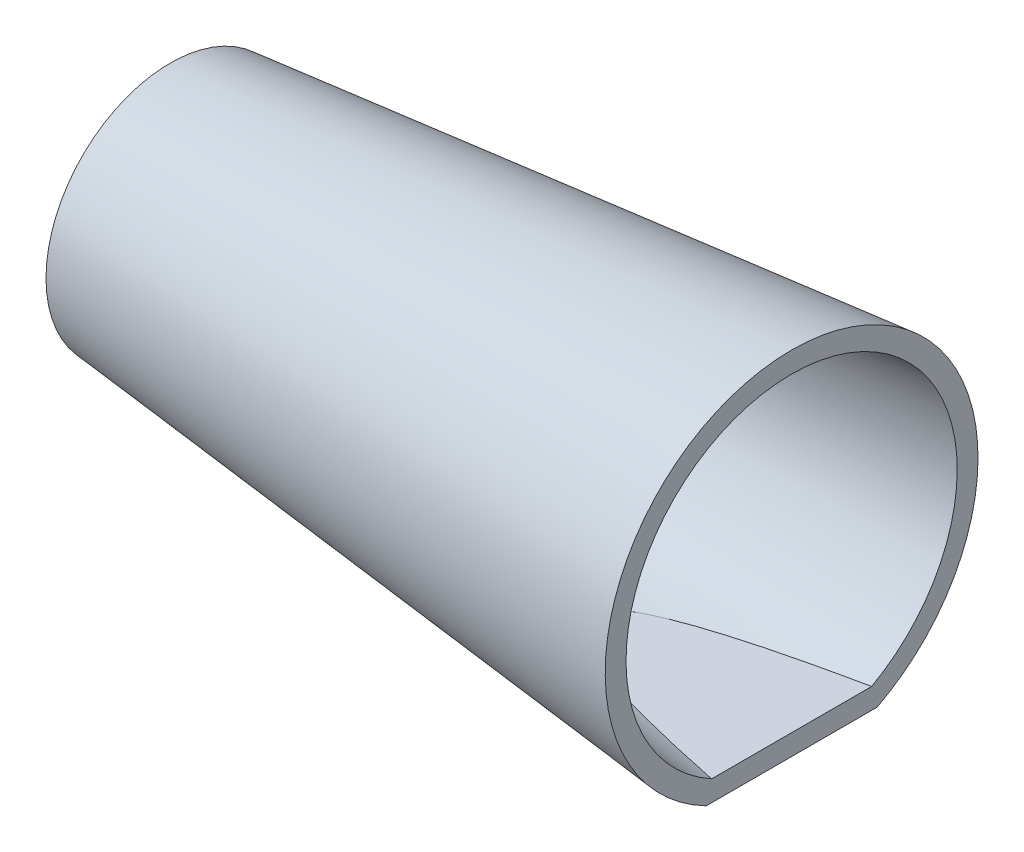
ISO-10303-21;
HEADER;
FILE_DESCRIPTION(('STEP AP214'),'2;1');
FILE_NAME('part.step','',(''),(''),'','','');
FILE_SCHEMA(('AUTOMOTIVE_DESIGN { 1 0 10303 214 1 1 1 1 }'));
ENDSEC;
DATA;
#1=APPLICATION_CONTEXT('core data for automotive mechanical design processes');
#2=APPLICATION_PROTOCOL_DEFINITION('international standard','automotive_design',2000,#1);
#3=PRODUCT_CONTEXT('',#1,'mechanical');
#4=PRODUCT('Part','Part','',(#3));
#5=PRODUCT_RELATED_PRODUCT_CATEGORY('part','',(#4));
#6=PRODUCT_DEFINITION_FORMATION('','',#4);
#7=PRODUCT_DEFINITION_CONTEXT('part definition',#1,'design');
#8=PRODUCT_DEFINITION('design','',#6,#7);
#9=PRODUCT_DEFINITION_SHAPE('','',#8);
#10=(LENGTH_UNIT() NAMED_UNIT(*) SI_UNIT(.MILLI.,.METRE.));
#11=(NAMED_UNIT(*) PLANE_ANGLE_UNIT() SI_UNIT($,.RADIAN.));
#12=(NAMED_UNIT(*) SI_UNIT($,.STERADIAN.) SOLID_ANGLE_UNIT());
#13=UNCERTAINTY_MEASURE_WITH_UNIT(LENGTH_MEASURE(1.E-05),#10,'distance_accuracy_value','');
#14=(GEOMETRIC_REPRESENTATION_CONTEXT(3) GLOBAL_UNCERTAINTY_ASSIGNED_CONTEXT((#13)) GLOBAL_UNIT_ASSIGNED_CONTEXT((#10,
#11,#12)) REPRESENTATION_CONTEXT('',''));
#15=CARTESIAN_POINT('',(0.,0.,0.));
#16=DIRECTION('',(0.,0.,1.));
#17=DIRECTION('',(1.,0.,0.));
#18=AXIS2_PLACEMENT_3D('',#15,#16,#17);
#19=CARTESIAN_POINT('',(71.458830615717,45.,0.));
#20=DIRECTION('',(-1.,0.,0.));
#21=DIRECTION('',(0.,0.,1.));
#22=AXIS2_PLACEMENT_3D('',#19,#20,#21);
#23=PLANE('',#22);
#24=CARTESIAN_POINT('',(71.458830615717,0.,0.));
#25=DIRECTION('',(-1.,0.,0.));
#26=DIRECTION('',(0.,0.,1.));
#27=AXIS2_PLACEMENT_3D('',#24,#25,#26);
#28=CIRCLE('',#27,39.9750621894396);
#29=CARTESIAN_POINT('',(71.458830615717,-35.,19.3133528174049));
#30=VERTEX_POINT('',#29);
#31=CARTESIAN_POINT('',(71.458830615717,-35.,-19.3133528174049));
#32=VERTEX_POINT('',#31);
#33=EDGE_CURVE('E78',#30,#32,#28,.T.);
#34=ORIENTED_EDGE('',*,*,#33,.T.);
#35=DIRECTION('',(0.,0.,1.));
#36=VECTOR('',#35,1.);
#37=CARTESIAN_POINT('',(71.458830615717,-35.,28.2842712474619));
#38=LINE('',#37,#36);
#39=EDGE_CURVE('E62',#32,#30,#38,.T.);
#40=ORIENTED_EDGE('',*,*,#39,.T.);
#41=EDGE_LOOP('',(#34,#40));
#42=FACE_BOUND('',#41,.T.);
#43=DIRECTION('',(0.,0.,1.));
#44=VECTOR('',#43,1.);
#45=CARTESIAN_POINT('',(71.458830615717,-40.,20.6155281280883));
#46=LINE('',#45,#44);
#47=CARTESIAN_POINT('',(71.458830615717,-40.,-20.6155281280883));
#48=VERTEX_POINT('',#47);
#49=CARTESIAN_POINT('',(71.458830615717,-40.,20.6155281280883));
#50=VERTEX_POINT('',#49);
#51=EDGE_CURVE('E56',#48,#50,#46,.T.);
#52=ORIENTED_EDGE('',*,*,#51,.F.);
#53=CARTESIAN_POINT('',(71.458830615717,0.,0.));
#54=DIRECTION('',(-1.,0.,0.));
#55=DIRECTION('',(0.,0.,1.));
#56=AXIS2_PLACEMENT_3D('',#53,#54,#55);
#57=CIRCLE('',#56,45.);
#58=EDGE_CURVE('E73',#50,#48,#57,.T.);
#59=ORIENTED_EDGE('',*,*,#58,.F.);
#60=EDGE_LOOP('',(#52,#59));
#61=FACE_BOUND('',#60,.T.);
#62=ADVANCED_FACE('F39',(#42,#61),#23,.F.);
#63=CARTESIAN_POINT('',(-78.541169384283,30.,0.));
#64=DIRECTION('',(1.,0.,0.));
#65=DIRECTION('',(0.,0.,-1.));
#66=AXIS2_PLACEMENT_3D('',#63,#64,#65);
#67=PLANE('',#66);
#68=CARTESIAN_POINT('',(-78.541169384283,0.,0.));
#69=DIRECTION('',(-1.,0.,0.));
#70=DIRECTION('',(0.,0.,1.));
#71=AXIS2_PLACEMENT_3D('',#68,#69,#70);
#72=CIRCLE('',#71,24.9750621894396);
#73=CARTESIAN_POINT('',(-78.541169384283,0.,24.9750621894396));
#74=VERTEX_POINT('',#73);
#75=EDGE_CURVE('E52',#74,#74,#72,.T.);
#76=ORIENTED_EDGE('',*,*,#75,.F.);
#77=EDGE_LOOP('',(#76));
#78=FACE_BOUND('',#77,.T.);
#79=CARTESIAN_POINT('',(-78.541169384283,0.,0.));
#80=DIRECTION('',(-1.,0.,0.));
#81=DIRECTION('',(0.,0.,1.));
#82=AXIS2_PLACEMENT_3D('',#79,#80,#81);
#83=CIRCLE('',#82,30.);
#84=CARTESIAN_POINT('',(-78.541169384283,0.,30.));
#85=VERTEX_POINT('',#84);
#86=EDGE_CURVE('E77',#85,#85,#83,.T.);
#87=ORIENTED_EDGE('',*,*,#86,.T.);
#88=EDGE_LOOP('',(#87));
#89=FACE_BOUND('',#88,.T.);
#90=ADVANCED_FACE('F41',(#78,#89),#67,.F.);
#91=CARTESIAN_POINT('',(-78.541169384283,0.,0.));
#92=DIRECTION('',(1.,0.,0.));
#93=DIRECTION('',(0.,0.,-1.));
#94=AXIS2_PLACEMENT_3D('',#91,#92,#93);
#95=CONICAL_SURFACE('',#94,24.9750621894396,0.0996686524911621);
#96=ORIENTED_EDGE('',*,*,#33,.F.);
#97=CARTESIAN_POINT('',(186.350283546478,-35.,37.7301557352129));
#98=CARTESIAN_POINT('',(182.454279049554,-35.,37.1986815468563));
#99=CARTESIAN_POINT('',(178.558950301767,-35.,36.6622149826518));
#100=CARTESIAN_POINT('',(170.769889321249,-35.,35.5776494343136));
#101=CARTESIAN_POINT('',(166.876157098331,-35.,35.0295503797463));
#102=CARTESIAN_POINT('',(159.089317005494,-35.,33.9198984021093));
#103=CARTESIAN_POINT('',(155.196209749136,-35.,33.3583411670407));
#104=CARTESIAN_POINT('',(147.412255762658,-35.,32.219809545767));
#105=CARTESIAN_POINT('',(143.521409027725,-35.,31.6428351925238));
#106=CARTESIAN_POINT('',(135.804779735487,-35.,30.4801963457749));
#107=CARTESIAN_POINT('',(131.978953936021,-35.,29.8948193882431));
#108=CARTESIAN_POINT('',(124.330543258662,-35.,28.703284255988));
#109=CARTESIAN_POINT('',(120.507958373713,-35.,28.0971261266366));
#110=CARTESIAN_POINT('',(112.867658375,-35.,26.85989129704));
#111=CARTESIAN_POINT('',(109.049942383243,-35.,26.2288200425046));
#112=CARTESIAN_POINT('',(103.327313455732,-35.,25.2590244248274));
#113=CARTESIAN_POINT('',(101.420433388773,-35.,24.9318953896265));
#114=CARTESIAN_POINT('',(97.6081866569257,-35.,24.2689421279981));
#115=CARTESIAN_POINT('',(95.7028199892517,-35.,23.9331179176187));
#116=CARTESIAN_POINT('',(91.8876891066364,-35.,23.2505547987246));
#117=CARTESIAN_POINT('',(89.9779305654848,-35.,22.9037841400547));
#118=CARTESIAN_POINT('',(86.1604945830343,-35.,22.198980976793));
#119=CARTESIAN_POINT('',(84.2528171364774,-35.,21.8409485007231));
#120=CARTESIAN_POINT('',(80.4391431665994,-35.,21.1117600640936));
#121=CARTESIAN_POINT('',(78.5331476753735,-35.,20.7405986955487));
#122=CARTESIAN_POINT('',(74.7241710566174,-35.,19.9831395175992));
#123=CARTESIAN_POINT('',(72.8211899130663,-35.,19.5968417889252));
#124=CARTESIAN_POINT('',(68.9975239063445,-35.,18.8018858782899));
#125=CARTESIAN_POINT('',(67.0768810803262,-35.,18.3930248374993));
#126=CARTESIAN_POINT('',(63.2404480185547,-35.,17.5531912073763));
#127=CARTESIAN_POINT('',(61.3246577230166,-35.,17.1222188918665));
#128=CARTESIAN_POINT('',(57.5015022804178,-35.,16.2334805862978));
#129=CARTESIAN_POINT('',(55.5941301248109,-35.,15.7757449820238));
#130=CARTESIAN_POINT('',(52.7396350496665,-35.,15.0630857013629));
#131=CARTESIAN_POINT('',(51.7892545020869,-35.,14.8211964086416));
#132=CARTESIAN_POINT('',(49.891097096383,-35.,14.3274217135146));
#133=CARTESIAN_POINT('',(48.9433202118315,-35.,14.0755364129723));
#134=CARTESIAN_POINT('',(47.0435436241095,-35.,13.5581888420881));
#135=CARTESIAN_POINT('',(46.0915684846838,-35.,13.2926361434121));
#136=CARTESIAN_POINT('',(44.1915159313643,-35.,12.7476822570286));
#137=CARTESIAN_POINT('',(43.243438756702,-35.,12.4682802326843));
#138=CARTESIAN_POINT('',(41.349472019015,-35.,11.8920552295413));
#139=CARTESIAN_POINT('',(40.4035974749212,-35.,11.5951826558267));
#140=CARTESIAN_POINT('',(38.518649884871,-35.,10.9810937954974));
#141=CARTESIAN_POINT('',(37.5795755710992,-35.,10.6638814156412));
#142=CARTESIAN_POINT('',(35.7228949788424,-35.,10.0082377965495));
#143=CARTESIAN_POINT('',(34.8051696235318,-35.,9.67014764478192));
#144=CARTESIAN_POINT('',(33.4376899264653,-35.,9.13845243053263));
#145=CARTESIAN_POINT('',(32.9831895140858,-35.,8.95704474291138));
#146=CARTESIAN_POINT('',(32.0781112534055,-35.,8.58471618084417));
#147=CARTESIAN_POINT('',(31.6275332184153,-35.,8.39379576210632));
#148=CARTESIAN_POINT('',(30.7333858410063,-35.,8.00169034951685));
#149=CARTESIAN_POINT('',(30.2897934397183,-35.,7.80055812799937));
#150=CARTESIAN_POINT('',(29.4088814686005,-35.,7.38505097086192));
#151=CARTESIAN_POINT('',(28.9715611590534,-35.,7.17067761296477));
#152=CARTESIAN_POINT('',(28.1057741910331,-35.,6.72605068909663));
#153=CARTESIAN_POINT('',(27.6772963794886,-35.,6.4958189470793));
#154=CARTESIAN_POINT('',(26.8318081403289,-35.,6.01529994671766));
#155=CARTESIAN_POINT('',(26.4147928572515,-35.,5.76502136159038));
#156=CARTESIAN_POINT('',(25.7929498474812,-35.,5.36454057234662));
#157=CARTESIAN_POINT('',(25.5820606035931,-35.,5.2237483122067));
#158=CARTESIAN_POINT('',(25.165873703854,-35.,4.93394569436684));
#159=CARTESIAN_POINT('',(24.9605778803501,-35.,4.78493269086272));
#160=CARTESIAN_POINT('',(24.5571517626382,-35.,4.47739050125056));
#161=CARTESIAN_POINT('',(24.3590223236098,-35.,4.3188601853862));
#162=CARTESIAN_POINT('',(23.9722207618701,-35.,3.99071947522033));
#163=CARTESIAN_POINT('',(23.7835457319139,-35.,3.82111252441186));
#164=CARTESIAN_POINT('',(23.3497969386347,-35.,3.40243481796509));
#165=CARTESIAN_POINT('',(23.1102660623288,-35.,3.14750608119597));
#166=CARTESIAN_POINT('',(22.6677338296465,-35.,2.60731153473858));
#167=CARTESIAN_POINT('',(22.4646623892727,-35.,2.32210564246017));
#168=CARTESIAN_POINT('',(22.1765630045945,-35.,1.82196513688646));
#169=CARTESIAN_POINT('',(22.0749764993332,-35.,1.61670984570263));
#170=CARTESIAN_POINT('',(21.9050488028257,-35.,1.19286077727259));
#171=CARTESIAN_POINT('',(21.8366524814127,-35.,0.974289802479358));
#172=CARTESIAN_POINT('',(21.740437045649,-35.,0.525599798421454));
#173=CARTESIAN_POINT('',(21.7130632258035,-35.,0.295381693269935));
#174=CARTESIAN_POINT('',(21.7045509743985,-35.,-0.165941984136228));
#175=CARTESIAN_POINT('',(21.7234073629978,-35.,-0.397047454069706));
#176=CARTESIAN_POINT('',(21.7989057742793,-35.,-0.820938272395699));
#177=CARTESIAN_POINT('',(21.8501835959972,-35.,-1.01472937719543));
#178=CARTESIAN_POINT('',(21.980118590157,-35.,-1.3927795961629));
#179=CARTESIAN_POINT('',(22.0587892255658,-35.,-1.57703397199548));
#180=CARTESIAN_POINT('',(22.3015803206306,-35.,-2.06172384719148));
#181=CARTESIAN_POINT('',(22.4866750503907,-35.,-2.35155956558503));
#182=CARTESIAN_POINT('',(22.8975129587987,-35.,-2.90082198808311));
#183=CARTESIAN_POINT('',(23.1233995812596,-35.,-3.16013586986531));
#184=CARTESIAN_POINT('',(23.678794706118,-35.,-3.73348210052018));
#185=CARTESIAN_POINT('',(24.0181086319025,-35.,-4.03787524389755));
#186=CARTESIAN_POINT('',(24.7241524973343,-35.,-4.61345161962295));
#187=CARTESIAN_POINT('',(25.0909385995484,-35.,-4.88456365557172));
#188=CARTESIAN_POINT('',(25.8441140530261,-35.,-5.40262218213483));
#189=CARTESIAN_POINT('',(26.2306030635226,-35.,-5.64942240764112));
#190=CARTESIAN_POINT('',(26.8191595667595,-35.,-6.0042774142289));
#191=CARTESIAN_POINT('',(27.016718108767,-35.,-6.11995273709664));
#192=CARTESIAN_POINT('',(27.4144178846647,-35.,-6.34677498085904));
#193=CARTESIAN_POINT('',(27.6145590693576,-35.,-6.45792198784727));
#194=CARTESIAN_POINT('',(28.2284696158912,-35.,-6.79083522970035));
#195=CARTESIAN_POINT('',(28.6457524649934,-35.,-7.00612863992177));
#196=CARTESIAN_POINT('',(29.4871872734164,-35.,-7.42290710475762));
#197=CARTESIAN_POINT('',(29.9113404068767,-35.,-7.62438976764953));
#198=CARTESIAN_POINT('',(30.7651536217108,-35.,-8.01594829312503));
#199=CARTESIAN_POINT('',(31.1948166840103,-35.,-8.20601763520696));
#200=CARTESIAN_POINT('',(32.0583405130523,-35.,-8.5763933662456));
#201=CARTESIAN_POINT('',(32.4922015232689,-35.,-8.75669918488445));
#202=CARTESIAN_POINT('',(33.8009739852497,-35.,-9.2859716592158));
#203=CARTESIAN_POINT('',(34.6809795170081,-35.,-9.62235103300177));
#204=CARTESIAN_POINT('',(36.4499452640393,-35.,-10.2694573889845));
#205=CARTESIAN_POINT('',(37.3389025844705,-35.,-10.5801923829812));
#206=CARTESIAN_POINT('',(39.1248927077788,-35.,-11.1818061876851));
#207=CARTESIAN_POINT('',(40.0219351964754,-35.,-11.472656134456));
#208=CARTESIAN_POINT('',(41.8212700680755,-35.,-12.0377928131519));
#209=CARTESIAN_POINT('',(42.7235628335804,-35.,-12.3120783209816));
#210=CARTESIAN_POINT('',(44.530809301017,-35.,-12.8463999451021));
#211=CARTESIAN_POINT('',(45.4357566266211,-35.,-13.1064576948935));
#212=CARTESIAN_POINT('',(47.2488959905115,-35.,-13.6148611800598));
#213=CARTESIAN_POINT('',(48.1570879270722,-35.,-13.8632072792138));
#214=CARTESIAN_POINT('',(49.9663193504966,-35.,-14.3471881647281));
#215=CARTESIAN_POINT('',(50.8673298780356,-35.,-14.5829314274666));
#216=CARTESIAN_POINT('',(52.6715639003859,-35.,-15.0458010853707));
#217=CARTESIAN_POINT('',(53.5747874126154,-35.,-15.2729274124797));
#218=CARTESIAN_POINT('',(56.28732966612,-35.,-15.942970559475));
#219=CARTESIAN_POINT('',(58.099456209242,-35.,-16.3745346169277));
#220=CARTESIAN_POINT('',(61.7295456984226,-35.,-17.2136331365688));
#221=CARTESIAN_POINT('',(63.5475095711505,-35.,-17.621163562093));
#222=CARTESIAN_POINT('',(67.1877661753194,-35.,-18.4164535427119));
#223=CARTESIAN_POINT('',(69.0100589515033,-35.,-18.8042128925166));
#224=CARTESIAN_POINT('',(72.6601476439812,-35.,-19.5636267515246));
#225=CARTESIAN_POINT('',(74.4879474606346,-35.,-19.9352624595714));
#226=CARTESIAN_POINT('',(78.1463582286523,-35.,-20.6644408226421));
#227=CARTESIAN_POINT('',(79.9769691915719,-35.,-21.0219834195748));
#228=CARTESIAN_POINT('',(83.6403337458931,-35.,-21.7248869414971));
#229=CARTESIAN_POINT('',(85.473087103383,-35.,-22.0702490875578));
#230=CARTESIAN_POINT('',(89.1405600277946,-35.,-22.7503750315425));
#231=CARTESIAN_POINT('',(90.9752795994412,-35.,-23.0851388039395));
#232=CARTESIAN_POINT('',(96.4741858266097,-35.,-24.0740951182745));
#233=CARTESIAN_POINT('',(100.140867688239,-35.,-24.7144270981085));
#234=CARTESIAN_POINT('',(107.479292876759,-35.,-25.9657573553522));
#235=CARTESIAN_POINT('',(111.151036318643,-35.,-26.5767549546388));
#236=CARTESIAN_POINT('',(118.496665713013,-35.,-27.7744998418122));
#237=CARTESIAN_POINT('',(122.170549800228,-35.,-28.3612585910286));
#238=CARTESIAN_POINT('',(129.521408923312,-35.,-29.5148555571752));
#239=CARTESIAN_POINT('',(133.198383936182,-35.,-30.0816939210063));
#240=CARTESIAN_POINT('',(140.99363558342,-35.,-31.2651457487388));
#241=CARTESIAN_POINT('',(145.112234862611,-35.,-31.8796314038055));
#242=CARTESIAN_POINT('',(153.352525257546,-35.,-33.0909263010355));
#243=CARTESIAN_POINT('',(157.474216681792,-35.,-33.6877334402989));
#244=CARTESIAN_POINT('',(165.720854683012,-35.,-34.8663481802272));
#245=CARTESIAN_POINT('',(169.845801832787,-35.,-35.4481517693868));
#246=CARTESIAN_POINT('',(176.034331179576,-35.,-36.3109964292797));
#247=CARTESIAN_POINT('',(178.097230137509,-35.,-36.5969503030382));
#248=CARTESIAN_POINT('',(182.223449089817,-35.,-37.1657962317832));
#249=CARTESIAN_POINT('',(184.286769083967,-35.,-37.4486882884059));
#250=CARTESIAN_POINT('',(186.350283546477,-35.,-37.7301557352129));
#251=B_SPLINE_CURVE_WITH_KNOTS('',3,(#97,#98,#99,#100,#101,#102,#103,#104,#105,#106,#107,#108,
#109,#110,#111,#112,#113,#114,#115,#116,#117,#118,#119,#120,#121,#122,#123,#124,#125,#126,#127,
#128,#129,#130,#131,#132,#133,#134,#135,#136,#137,#138,#139,#140,#141,#142,#143,#144,#145,#146,
#147,#148,#149,#150,#151,#152,#153,#154,#155,#156,#157,#158,#159,#160,#161,#162,#163,#164,#165,
#166,#167,#168,#169,#170,#171,#172,#173,#174,#175,#176,#177,#178,#179,#180,#181,#182,#183,#184,
#185,#186,#187,#188,#189,#190,#191,#192,#193,#194,#195,#196,#197,#198,#199,#200,#201,#202,#203,
#204,#205,#206,#207,#208,#209,#210,#211,#212,#213,#214,#215,#216,#217,#218,#219,#220,#221,#222,
#223,#224,#225,#226,#227,#228,#229,#230,#231,#232,#233,#234,#235,#236,#237,#238,#239,#240,#241,
#242,#243,#244,#245,#246,#247,#248,#249,#250),.UNSPECIFIED.,.F.,.F.,(4,2,2,2,2,2,2,2,2,2,2,2,2,
2,2,2,2,2,2,2,2,2,2,2,2,2,2,2,2,2,2,2,2,2,2,2,2,2,2,2,2,2,2,2,2,2,2,2,2,2,2,2,2,2,2,2,2,2,2,2,2,
2,2,2,2,2,2,2,2,2,2,2,2,2,2,2,4),(0.,11.7962684823454,23.592608410352,35.3927797931669,
47.1929259491219,58.8039274044442,70.4149035108698,82.0233555000142,87.8275485943876,
93.6317309771744,99.4546604048794,105.277575086463,111.102916901916,116.928227651796,
122.819156087832,128.71001158909,134.594304083698,137.53630153506,140.478269013987,
143.443138930169,146.408188172739,149.382103692669,152.355449700442,155.288973272614,
156.756987835946,158.224932141416,159.685939218185,161.146772545962,162.605634194542,
164.0638680446,164.824419158688,165.585216496717,166.346104324751,167.106756724498,
168.154077745926,169.199363486369,169.88422168165,170.567938373869,171.259024296121,
171.950032789525,172.549053836307,173.148369705314,174.17404603762,175.203401975957,
176.567593896342,177.93465509776,179.309494155256,179.996251210805,180.682995203442,
182.091286762397,183.499821594,184.909153620787,186.318567882445,189.144283708015,
191.969113356775,194.797959928467,197.627015293913,200.451642133543,203.276181178707,
206.07015314916,208.864147181797,214.452333575465,220.041455897621,225.630636241727,
231.226167755674,236.821722331779,242.416714358521,248.011719860148,259.178071839221,
270.344681826731,281.50594979411,292.66713543655,305.159649004396,317.653642665974,
330.15094292599,336.39881235001,342.646678434916),.UNSPECIFIED.);
#252=EDGE_CURVE('E83',#30,#32,#251,.T.);
#253=ORIENTED_EDGE('',*,*,#252,.T.);
#254=EDGE_LOOP('',(#96,#253));
#255=FACE_BOUND('',#254,.T.);
#256=ORIENTED_EDGE('',*,*,#75,.T.);
#257=EDGE_LOOP('',(#256));
#258=FACE_BOUND('',#257,.T.);
#259=ADVANCED_FACE('F93',(#255,#258),#95,.F.);
#260=CARTESIAN_POINT('',(71.458830615717,0.,0.));
#261=DIRECTION('',(1.,0.,0.));
#262=DIRECTION('',(0.,0.,-1.));
#263=AXIS2_PLACEMENT_3D('',#260,#261,#262);
#264=CONICAL_SURFACE('',#263,45.,0.099668652491162);
#265=ORIENTED_EDGE('',*,*,#58,.T.);
#266=CARTESIAN_POINT('',(227.022522476758,-40.,-45.4650838446794));
#267=CARTESIAN_POINT('',(222.487531174623,-40.,-44.8610044974402));
#268=CARTESIAN_POINT('',(217.953210537732,-40.,-44.2518579452056));
#269=CARTESIAN_POINT('',(208.886136625516,-40.,-43.0218814304395));
#270=CARTESIAN_POINT('',(204.353383356444,-40.,-42.4010514218427));
#271=CARTESIAN_POINT('',(195.28913014126,-40.,-41.1460840074608));
#272=CARTESIAN_POINT('',(190.757630427587,-40.,-40.5119449207839));
#273=CARTESIAN_POINT('',(181.696788093227,-40.,-39.2284642878314));
#274=CARTESIAN_POINT('',(177.167445469739,-40.,-38.579122761348));
#275=CARTESIAN_POINT('',(168.08182698658,-40.,-37.2585316167237));
#276=CARTESIAN_POINT('',(163.525567839631,-40.,-36.5871668565746));
#277=CARTESIAN_POINT('',(154.416188525221,-40.,-35.2234733804564));
#278=CARTESIAN_POINT('',(149.863068353225,-40.,-34.5311446948384));
#279=CARTESIAN_POINT('',(140.760972587622,-40.,-33.1215461668741));
#280=CARTESIAN_POINT('',(136.211996755005,-40.,-32.4042778703856));
#281=CARTESIAN_POINT('',(127.118923264347,-40.,-30.9394841547392));
#282=CARTESIAN_POINT('',(122.574825578805,-40.,-30.1919589070843));
#283=CARTESIAN_POINT('',(115.766522381752,-40.,-29.0429937028531));
#284=CARTESIAN_POINT('',(113.499932982799,-40.,-28.6556650314809));
#285=CARTESIAN_POINT('',(108.968588847599,-40.,-27.8704252720756));
#286=CARTESIAN_POINT('',(106.703834108381,-40.,-27.4725142012157));
#287=CARTESIAN_POINT('',(102.176289370412,-40.,-26.6646706601136));
#288=CARTESIAN_POINT('',(99.9134995341785,-40.,-26.2547372779458));
#289=CARTESIAN_POINT('',(95.3904489571135,-40.,-25.4211410563647));
#290=CARTESIAN_POINT('',(93.1301882130662,-40.,-24.9974782344308));
#291=CARTESIAN_POINT('',(88.6197300661953,-40.,-24.1356070524724));
#292=CARTESIAN_POINT('',(86.3695232420194,-40.,-23.6974480876006));
#293=CARTESIAN_POINT('',(81.8727923295657,-40.,-22.8026288949495));
#294=CARTESIAN_POINT('',(79.6262682240774,-40.,-22.3459687538901));
#295=CARTESIAN_POINT('',(75.1381691159446,-40.,-21.4106928073643));
#296=CARTESIAN_POINT('',(72.8965933624426,-40.,-20.9320806129534));
#297=CARTESIAN_POINT('',(68.4193152065769,-40.,-19.9481604354528));
#298=CARTESIAN_POINT('',(66.1836126960529,-40.,-19.4428529476468));
#299=CARTESIAN_POINT('',(62.8365905832342,-40.,-18.660079491975));
#300=CARTESIAN_POINT('',(61.7223458804596,-40.,-18.395104701046));
#301=CARTESIAN_POINT('',(59.4961414733571,-40.,-17.8557354503037));
#302=CARTESIAN_POINT('',(58.3841817539827,-40.,-17.58134105273));
#303=CARTESIAN_POINT('',(56.1625778792451,-40.,-17.0217347038396));
#304=CARTESIAN_POINT('',(55.0529346478104,-40.,-16.7365190782898));
#305=CARTESIAN_POINT('',(52.8368974942351,-40.,-16.1537312174942));
#306=CARTESIAN_POINT('',(51.7305035522786,-40.,-15.8561590577734));
#307=CARTESIAN_POINT('',(49.5141300141384,-40.,-15.2445148687361));
#308=CARTESIAN_POINT('',(48.4041776446067,-40.,-14.9303439140027));
#309=CARTESIAN_POINT('',(46.1893254584769,-40.,-14.2846761340775));
#310=CARTESIAN_POINT('',(45.084425549478,-40.,-13.9531796271292));
#311=CARTESIAN_POINT('',(42.8819749185034,-40.,-13.2694895450365));
#312=CARTESIAN_POINT('',(41.7844191201645,-40.,-12.9173123764858));
#313=CARTESIAN_POINT('',(39.5979666053116,-40.,-12.1870884755424));
#314=CARTESIAN_POINT('',(38.5090691550795,-40.,-11.8090439618267));
#315=CARTESIAN_POINT('',(36.8797746697224,-40.,-11.2152589476136));
#316=CARTESIAN_POINT('',(36.3348663950791,-40.,-11.0118841135342));
#317=CARTESIAN_POINT('',(35.2488012863432,-40.,-10.5953716694404));
#318=CARTESIAN_POINT('',(34.7076443294524,-40.,-10.3822343807513));
#319=CARTESIAN_POINT('',(33.6289391070251,-40.,-9.94420090722238));
#320=CARTESIAN_POINT('',(33.0913992861755,-40.,-9.71928386142794));
#321=CARTESIAN_POINT('',(32.0221749122633,-40.,-9.25599460942954));
#322=CARTESIAN_POINT('',(31.4904898859269,-40.,-9.01762350047338));
#323=CARTESIAN_POINT('',(30.4401612441023,-40.,-8.52725557774276));
#324=CARTESIAN_POINT('',(29.9214394163732,-40.,-8.27542709499418));
#325=CARTESIAN_POINT('',(28.8938924449062,-40.,-7.75236406162434));
#326=CARTESIAN_POINT('',(28.3850657155182,-40.,-7.48113265338397));
#327=CARTESIAN_POINT('',(27.3824999482697,-40.,-6.91503598642662));
#328=CARTESIAN_POINT('',(26.8887231781951,-40.,-6.62023795415075));
#329=CARTESIAN_POINT('',(25.9213265827571,-40.,-5.99946129274958));
#330=CARTESIAN_POINT('',(25.4476880695071,-40.,-5.67351252552059));
#331=CARTESIAN_POINT('',(24.8366686639801,-40.,-5.21055271550022));
#332=CARTESIAN_POINT('',(24.6851994194234,-40.,-5.09209755038007));
#333=CARTESIAN_POINT('',(24.3865137326607,-40.,-4.84991203107875));
#334=CARTESIAN_POINT('',(24.2392978687927,-40.,-4.72618096513633));
#335=CARTESIAN_POINT('',(23.804662641454,-40.,-4.34573821191916));
#336=CARTESIAN_POINT('',(23.5247928214543,-40.,-4.08017588425334));
#337=CARTESIAN_POINT('',(22.9925192399959,-40.,-3.51745533761036));
#338=CARTESIAN_POINT('',(22.7404078285134,-40.,-3.22001594988085));
#339=CARTESIAN_POINT('',(22.2842592310214,-40.,-2.59001775526068));
#340=CARTESIAN_POINT('',(22.0800790158794,-40.,-2.25756783624146));
#341=CARTESIAN_POINT('',(21.8080960814921,-40.,-1.68636334487399));
#342=CARTESIAN_POINT('',(21.7177866509671,-40.,-1.45846103390034));
#343=CARTESIAN_POINT('',(21.5748287232688,-40.,-0.991166069921868));
#344=CARTESIAN_POINT('',(21.5221208188312,-40.,-0.751792182556264));
#345=CARTESIAN_POINT('',(21.4602376886429,-40.,-0.265655056155361));
#346=CARTESIAN_POINT('',(21.451356942354,-40.,-0.0188530119695326));
#347=CARTESIAN_POINT('',(21.479150349536,-40.,0.472216879137571));
#348=CARTESIAN_POINT('',(21.515853379019,-40.,0.716483020759298));
#349=CARTESIAN_POINT('',(21.6385702556331,-40.,1.23031660323285));
#350=CARTESIAN_POINT('',(21.731058923303,-40.,1.49830167628395));
#351=CARTESIAN_POINT('',(21.9580465337833,-40.,2.01582134176329));
#352=CARTESIAN_POINT('',(22.0926306382288,-40.,2.26531725245236));
#353=CARTESIAN_POINT('',(22.3670642294977,-40.,2.70438512323132));
#354=CARTESIAN_POINT('',(22.5022133329345,-40.,2.89697432176991));
#355=CARTESIAN_POINT('',(22.7887402809387,-40.,3.26979171642502));
#356=CARTESIAN_POINT('',(22.9401302717372,-40.,3.45001049343862));
#357=CARTESIAN_POINT('',(23.2556068145839,-40.,3.79958754031436));
#358=CARTESIAN_POINT('',(23.4197210980245,-40.,3.96892052913808));
#359=CARTESIAN_POINT('',(23.7575229928307,-40.,4.29756399223005));
#360=CARTESIAN_POINT('',(23.9312076215503,-40.,4.45687755632634));
#361=CARTESIAN_POINT('',(24.3794492106652,-40.,4.84825049287801));
#362=CARTESIAN_POINT('',(24.6590413143531,-40.,5.07453146582164));
#363=CARTESIAN_POINT('',(25.2309438345073,-40.,5.51052006204152));
#364=CARTESIAN_POINT('',(25.5232612977164,-40.,5.72021831677495));
#365=CARTESIAN_POINT('',(26.1178496511432,-40.,6.12613898352389));
#366=CARTESIAN_POINT('',(26.4201379661349,-40.,6.32233572923939));
#367=CARTESIAN_POINT('',(27.0319822287876,-40.,6.70306605852968));
#368=CARTESIAN_POINT('',(27.3415390756136,-40.,6.88759818857872));
#369=CARTESIAN_POINT('',(27.9682994074718,-40.,7.24783592751426));
#370=CARTESIAN_POINT('',(28.2855385812054,-40.,7.42347919395463));
#371=CARTESIAN_POINT('',(28.9246618417805,-40.,7.76610256018713));
#372=CARTESIAN_POINT('',(29.2465461236422,-40.,7.93308229488933));
#373=CARTESIAN_POINT('',(29.8936888891577,-40.,8.25928935156558));
#374=CARTESIAN_POINT('',(30.2189424837179,-40.,8.41852639754469));
#375=CARTESIAN_POINT('',(30.8725873883342,-40.,8.73037424948824));
#376=CARTESIAN_POINT('',(31.2009785946958,-40.,8.88298527351746));
#377=CARTESIAN_POINT('',(32.2798521448279,-40.,9.37281097330368));
#378=CARTESIAN_POINT('',(33.0358533375635,-40.,9.69789498074403));
#379=CARTESIAN_POINT('',(34.5575565557765,-40.,10.3246149568611));
#380=CARTESIAN_POINT('',(35.3232602498903,-40.,10.6262468267986));
#381=CARTESIAN_POINT('',(36.8622717615589,-40.,11.2106946960072));
#382=CARTESIAN_POINT('',(37.6355835294956,-40.,11.493500256044));
#383=CARTESIAN_POINT('',(39.187768887056,-40.,12.0434285587273));
#384=CARTESIAN_POINT('',(39.9666426741741,-40.,12.3105507413566));
#385=CARTESIAN_POINT('',(41.5306446571993,-40.,12.8321995743362));
#386=CARTESIAN_POINT('',(42.3157833263315,-40.,13.0866947364925));
#387=CARTESIAN_POINT('',(43.8896555772195,-40.,13.5843149879737));
#388=CARTESIAN_POINT('',(44.6783892087904,-40.,13.8274399192133));
#389=CARTESIAN_POINT('',(47.0484841250794,-40.,14.5419439052461));
#390=CARTESIAN_POINT('',(48.6342792204414,-40.,14.9986296017101));
#391=CARTESIAN_POINT('',(51.8162011183918,-40.,15.8821954718895));
#392=CARTESIAN_POINT('',(53.4123383327191,-40.,16.3090377969518));
#393=CARTESIAN_POINT('',(56.6110569751689,-40.,17.1382870687826));
#394=CARTESIAN_POINT('',(58.2136388845285,-40.,17.5406921532465));
#395=CARTESIAN_POINT('',(61.4213317911474,-40.,18.3247843852949));
#396=CARTESIAN_POINT('',(63.026435526521,-40.,18.7065013369216));
#397=CARTESIAN_POINT('',(65.4369952358639,-40.,19.2664056660497));
#398=CARTESIAN_POINT('',(66.2409879673003,-40.,19.4509261173234));
#399=CARTESIAN_POINT('',(67.8498600050808,-40.,19.8160636790362));
#400=CARTESIAN_POINT('',(68.6547393119295,-40.,19.9966807872524));
#401=CARTESIAN_POINT('',(71.1085250771884,-40.,20.5415533116701));
#402=CARTESIAN_POINT('',(72.7587097222626,-40.,20.9000602794429));
#403=CARTESIAN_POINT('',(76.0618563418643,-40.,21.6040657540012));
#404=CARTESIAN_POINT('',(77.7148183376218,-40.,21.949564160873));
#405=CARTESIAN_POINT('',(81.0231174373285,-40.,22.6292172564162));
#406=CARTESIAN_POINT('',(82.6784546049169,-40.,22.9633716349942));
#407=CARTESIAN_POINT('',(85.9911203492787,-40.,23.6216695007525));
#408=CARTESIAN_POINT('',(87.6484489328123,-40.,23.9458129538492));
#409=CARTESIAN_POINT('',(92.6233768574073,-40.,24.9050189651697));
#410=CARTESIAN_POINT('',(95.9435434288258,-40.,25.5267807164205));
#411=CARTESIAN_POINT('',(102.589095593875,-40.,26.7417553046243));
#412=CARTESIAN_POINT('',(105.914481224481,-40.,27.3349679383668));
#413=CARTESIAN_POINT('',(110.907691327452,-40.,28.2074217431569));
#414=CARTESIAN_POINT('',(112.57397504142,-40.,28.495517099159));
#415=CARTESIAN_POINT('',(115.907464921396,-40.,29.0662724793227));
#416=CARTESIAN_POINT('',(117.574671082945,-40.,29.3489325295305));
#417=CARTESIAN_POINT('',(122.577558919981,-40.,30.1894481405331));
#418=CARTESIAN_POINT('',(125.914496348352,-40.,30.7398367933394));
#419=CARTESIAN_POINT('',(132.590880174702,-40.,31.823603605482));
#420=CARTESIAN_POINT('',(135.93032637616,-40.,32.3569829786653));
#421=CARTESIAN_POINT('',(142.611522066493,-40.,33.4090764393418));
#422=CARTESIAN_POINT('',(145.95327155284,-40.,33.9277905429106));
#423=CARTESIAN_POINT('',(152.532479279574,-40.,34.9361337849665));
#424=CARTESIAN_POINT('',(155.76987623221,-40.,35.4261633371419));
#425=CARTESIAN_POINT('',(162.246257731113,-40.,36.3956109427123));
#426=CARTESIAN_POINT('',(165.485242277594,-40.,36.8750289946695));
#427=CARTESIAN_POINT('',(171.964668652609,-40.,37.8244251954761));
#428=CARTESIAN_POINT('',(175.205110512584,-40.,38.2944031295722));
#429=CARTESIAN_POINT('',(181.687211802827,-40.,39.2258874747172));
#430=CARTESIAN_POINT('',(184.928871233461,-40.,39.6873938832167));
#431=CARTESIAN_POINT('',(191.406886463802,-40.,40.6018694997081));
#432=CARTESIAN_POINT('',(194.643240145215,-40.,41.054853722219));
#433=CARTESIAN_POINT('',(201.116905262035,-40.,41.9539285433328));
#434=CARTESIAN_POINT('',(204.354216697675,-40.,42.4000191402589));
#435=CARTESIAN_POINT('',(210.82958339528,-40.,43.2859132127729));
#436=CARTESIAN_POINT('',(214.067638627136,-40.,43.7257169085705));
#437=CARTESIAN_POINT('',(220.544521192534,-40.,44.5995783339218));
#438=CARTESIAN_POINT('',(223.7833485253,-40.,45.033636069231));
#439=CARTESIAN_POINT('',(227.022522476758,-40.,45.4650838446794));
#440=B_SPLINE_CURVE_WITH_KNOTS('',3,(#266,#267,#268,#269,#270,#271,#272,#273,#274,#275,#276,
#277,#278,#279,#280,#281,#282,#283,#284,#285,#286,#287,#288,#289,#290,#291,#292,#293,#294,#295,
#296,#297,#298,#299,#300,#301,#302,#303,#304,#305,#306,#307,#308,#309,#310,#311,#312,#313,#314,
#315,#316,#317,#318,#319,#320,#321,#322,#323,#324,#325,#326,#327,#328,#329,#330,#331,#332,#333,
#334,#335,#336,#337,#338,#339,#340,#341,#342,#343,#344,#345,#346,#347,#348,#349,#350,#351,#352,
#353,#354,#355,#356,#357,#358,#359,#360,#361,#362,#363,#364,#365,#366,#367,#368,#369,#370,#371,
#372,#373,#374,#375,#376,#377,#378,#379,#380,#381,#382,#383,#384,#385,#386,#387,#388,#389,#390,
#391,#392,#393,#394,#395,#396,#397,#398,#399,#400,#401,#402,#403,#404,#405,#406,#407,#408,#409,
#410,#411,#412,#413,#414,#415,#416,#417,#418,#419,#420,#421,#422,#423,#424,#425,#426,#427,#428,
#429,#430,#431,#432,#433,#434,#435,#436,#437,#438,#439),.UNSPECIFIED.,.F.,.F.,(4,2,2,2,2,2,2,2,
2,2,2,2,2,2,2,2,2,2,2,2,2,2,2,2,2,2,2,2,2,2,2,2,2,2,2,2,2,2,2,2,2,2,2,2,2,2,2,2,2,2,2,2,2,2,2,2,
2,2,2,2,2,2,2,2,2,2,2,2,2,2,2,2,2,2,2,2,2,2,2,2,2,2,2,2,2,2,4),(0.,13.725145443174,
27.4503450127466,41.17728858626,54.9042142896034,68.7205425773971,82.5368508632119,
96.3523042797783,110.167679398348,117.065996737809,123.964302883368,130.863133644863,
137.761955623612,144.639297846241,151.516607836654,158.39279055669,165.268845746164,
168.704766469466,172.140664494439,175.577739770002,179.014794040723,182.475354555167,
185.935851526825,189.393639328582,192.851130922102,194.595928580529,196.340668851236,
198.088610889059,199.836410578659,201.565954056925,203.295218060141,205.01971405089,
206.742573168166,207.319331184019,207.896167256859,209.051841895536,210.21871239256,
211.382055322845,212.114906798193,212.846597849805,213.583198582473,214.320266168635,
215.166051132222,216.013558359967,216.718394265376,217.423761027454,218.13071078742,
218.837441455589,219.915647447389,220.994458292135,222.075266322073,223.156208766894,
224.243904033989,225.331645100488,226.417982793282,227.504284707168,229.972492368307,
232.441130433929,234.911126155322,237.381210020974,239.857172283702,242.333168960631,
247.283458219822,252.239915852975,257.196750733339,262.1462436788,264.620921395095,
267.095600520631,272.161569541014,277.227577463176,282.293723755288,287.359887293895,
297.493362285952,307.626909396693,312.699918834445,317.772903955968,327.918915610867,
338.06420157996,348.209476427648,358.032277941998,367.855080787182,377.678106838769,
387.501135846341,397.304832060103,407.10853065842,416.911885019472,426.715229560048),.UNSPECIFIED.);
#441=EDGE_CURVE('E11',#48,#50,#440,.T.);
#442=ORIENTED_EDGE('',*,*,#441,.T.);
#443=EDGE_LOOP('',(#265,#442));
#444=FACE_BOUND('',#443,.T.);
#445=ORIENTED_EDGE('',*,*,#86,.F.);
#446=EDGE_LOOP('',(#445));
#447=FACE_BOUND('',#446,.T.);
#448=ADVANCED_FACE('F76',(#444,#447),#264,.T.);
#449=CARTESIAN_POINT('',(-78.542169384283,-35.,28.2842712474619));
#450=DIRECTION('',(0.,1.,0.));
#451=DIRECTION('',(0.,0.,1.));
#452=AXIS2_PLACEMENT_3D('',#449,#450,#451);
#453=PLANE('',#452);
#454=ORIENTED_EDGE('',*,*,#252,.F.);
#455=ORIENTED_EDGE('',*,*,#39,.F.);
#456=EDGE_LOOP('',(#454,#455));
#457=FACE_BOUND('',#456,.T.);
#458=ADVANCED_FACE('F100',(#457),#453,.T.);
#459=CARTESIAN_POINT('',(-78.541169384283,-40.,20.6155281280883));
#460=DIRECTION('',(0.,1.,0.));
#461=DIRECTION('',(0.,0.,1.));
#462=AXIS2_PLACEMENT_3D('',#459,#460,#461);
#463=PLANE('',#462);
#464=ORIENTED_EDGE('',*,*,#51,.T.);
#465=ORIENTED_EDGE('',*,*,#441,.F.);
#466=EDGE_LOOP('',(#464,#465));
#467=FACE_BOUND('',#466,.T.);
#468=ADVANCED_FACE('F68',(#467),#463,.F.);
#469=CLOSED_SHELL('',(#62,#90,#259,#448,#458,#468));
#470=MANIFOLD_SOLID_BREP('B2',#469);
#471=ADVANCED_BREP_SHAPE_REPRESENTATION('',(#18,#470),#14);
#472=SHAPE_DEFINITION_REPRESENTATION(#9,#471);
ENDSEC;
END-ISO-10303-21;
